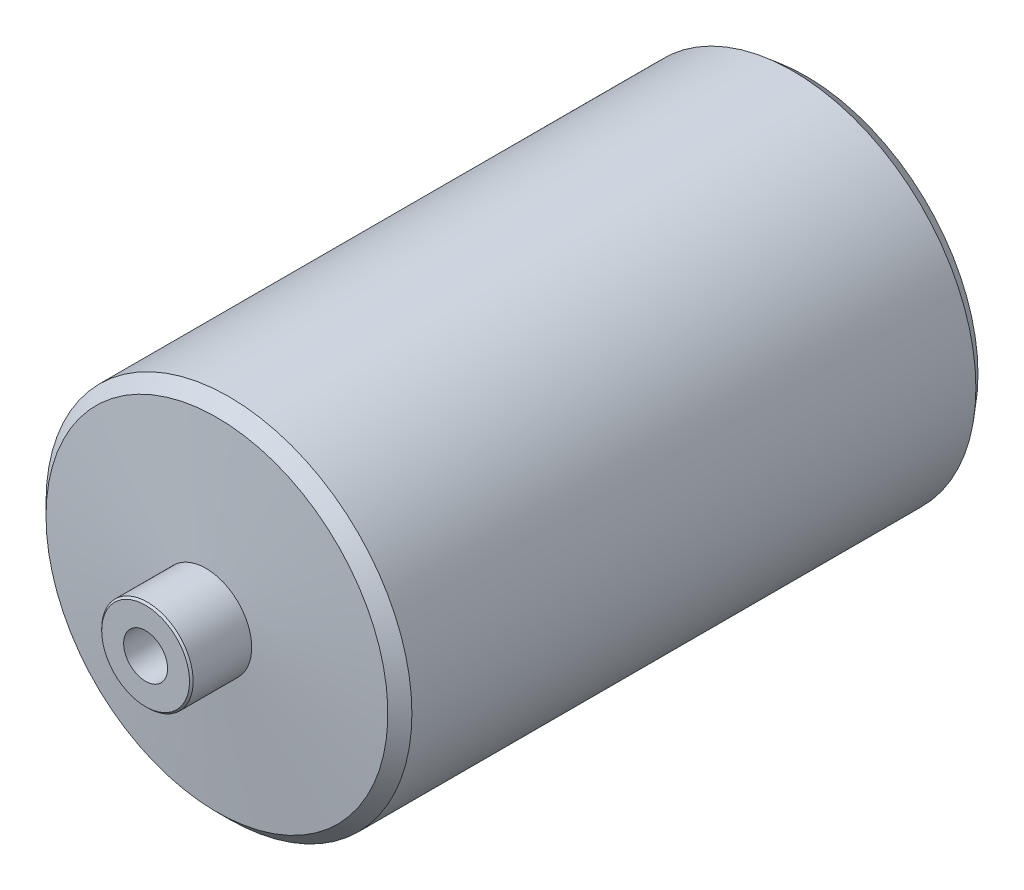
ISO-10303-21;
HEADER;
FILE_DESCRIPTION(('STEP AP214'),'2;1');
FILE_NAME('part.step','',(''),(''),'','','');
FILE_SCHEMA(('AUTOMOTIVE_DESIGN { 1 0 10303 214 1 1 1 1 }'));
ENDSEC;
DATA;
#1=APPLICATION_CONTEXT('core data for automotive mechanical design processes');
#2=APPLICATION_PROTOCOL_DEFINITION('international standard','automotive_design',2000,#1);
#3=PRODUCT_CONTEXT('',#1,'mechanical');
#4=PRODUCT('Part','Part','',(#3));
#5=PRODUCT_RELATED_PRODUCT_CATEGORY('part','',(#4));
#6=PRODUCT_DEFINITION_FORMATION('','',#4);
#7=PRODUCT_DEFINITION_CONTEXT('part definition',#1,'design');
#8=PRODUCT_DEFINITION('design','',#6,#7);
#9=PRODUCT_DEFINITION_SHAPE('','',#8);
#10=(LENGTH_UNIT() NAMED_UNIT(*) SI_UNIT(.MILLI.,.METRE.));
#11=(NAMED_UNIT(*) PLANE_ANGLE_UNIT() SI_UNIT($,.RADIAN.));
#12=(NAMED_UNIT(*) SI_UNIT($,.STERADIAN.) SOLID_ANGLE_UNIT());
#13=UNCERTAINTY_MEASURE_WITH_UNIT(LENGTH_MEASURE(1.E-05),#10,'distance_accuracy_value','');
#14=(GEOMETRIC_REPRESENTATION_CONTEXT(3) GLOBAL_UNCERTAINTY_ASSIGNED_CONTEXT((#13)) GLOBAL_UNIT_ASSIGNED_CONTEXT((#10,
#11,#12)) REPRESENTATION_CONTEXT('',''));
#15=CARTESIAN_POINT('',(0.,0.,0.));
#16=DIRECTION('',(0.,0.,1.));
#17=DIRECTION('',(1.,0.,0.));
#18=AXIS2_PLACEMENT_3D('',#15,#16,#17);
#19=CARTESIAN_POINT('',(0.,0.,0.));
#20=DIRECTION('',(0.,0.,1.));
#21=DIRECTION('',(1.,0.,0.));
#22=AXIS2_PLACEMENT_3D('',#19,#20,#21);
#23=PLANE('',#22);
#24=CARTESIAN_POINT('',(0.,0.,0.));
#25=DIRECTION('',(0.,0.,1.));
#26=DIRECTION('',(1.,0.,0.));
#27=AXIS2_PLACEMENT_3D('',#24,#25,#26);
#28=CIRCLE('',#27,12.);
#29=CARTESIAN_POINT('',(12.,0.,0.));
#30=VERTEX_POINT('',#29);
#31=EDGE_CURVE('E112',#30,#30,#28,.F.);
#32=ORIENTED_EDGE('',*,*,#31,.T.);
#33=EDGE_LOOP('',(#32));
#34=FACE_BOUND('',#33,.T.);
#35=CARTESIAN_POINT('',(0.,0.,0.));
#36=DIRECTION('',(0.,0.,-1.));
#37=DIRECTION('',(-1.,0.,0.));
#38=AXIS2_PLACEMENT_3D('',#35,#36,#37);
#39=CIRCLE('',#38,6.);
#40=CARTESIAN_POINT('',(-6.,0.,0.));
#41=VERTEX_POINT('',#40);
#42=EDGE_CURVE('E70',#41,#41,#39,.T.);
#43=ORIENTED_EDGE('',*,*,#42,.F.);
#44=EDGE_LOOP('',(#43));
#45=FACE_BOUND('',#44,.T.);
#46=ADVANCED_FACE('F43',(#34,#45),#23,.F.);
#47=CARTESIAN_POINT('',(0.,0.,200.));
#48=DIRECTION('',(0.,0.,1.));
#49=DIRECTION('',(1.,0.,0.));
#50=AXIS2_PLACEMENT_3D('',#47,#48,#49);
#51=CYLINDRICAL_SURFACE('',#50,12.5);
#52=CARTESIAN_POINT('',(0.,0.,0.500000000000056));
#53=DIRECTION('',(0.,0.,1.));
#54=DIRECTION('',(1.,0.,0.));
#55=AXIS2_PLACEMENT_3D('',#52,#53,#54);
#56=CIRCLE('',#55,12.5);
#57=CARTESIAN_POINT('',(12.5,0.,0.500000000000056));
#58=VERTEX_POINT('',#57);
#59=EDGE_CURVE('E108',#58,#58,#56,.T.);
#60=ORIENTED_EDGE('',*,*,#59,.T.);
#61=EDGE_LOOP('',(#60));
#62=FACE_BOUND('',#61,.T.);
#63=CARTESIAN_POINT('',(0.,0.,16.5));
#64=DIRECTION('',(0.,0.,1.));
#65=DIRECTION('',(1.,0.,0.));
#66=AXIS2_PLACEMENT_3D('',#63,#64,#65);
#67=CIRCLE('',#66,12.5);
#68=CARTESIAN_POINT('',(12.5,0.,16.5));
#69=VERTEX_POINT('',#68);
#70=EDGE_CURVE('E88',#69,#69,#67,.T.);
#71=ORIENTED_EDGE('',*,*,#70,.F.);
#72=EDGE_LOOP('',(#71));
#73=FACE_BOUND('',#72,.T.);
#74=ADVANCED_FACE('F131',(#62,#73),#51,.T.);
#75=CARTESIAN_POINT('',(0.,0.,16.5));
#76=DIRECTION('',(0.,0.,1.));
#77=DIRECTION('',(1.,0.,0.));
#78=AXIS2_PLACEMENT_3D('',#75,#76,#77);
#79=CONICAL_SURFACE('',#78,12.5,1.48352986419518);
#80=CARTESIAN_POINT('',(0.,0.,19.5193576539793));
#81=DIRECTION('',(0.,0.,-1.));
#82=DIRECTION('',(-1.,0.,0.));
#83=AXIS2_PLACEMENT_3D('',#80,#81,#82);
#84=CIRCLE('',#83,47.0114159057248);
#85=CARTESIAN_POINT('',(47.0114159057248,0.,19.5193576539793));
#86=VERTEX_POINT('',#85);
#87=EDGE_CURVE('E104',#86,#86,#84,.T.);
#88=CARTESIAN_POINT('',(47.0114159057248,0.,19.5193576539793));
#89=CARTESIAN_POINT('',(46.6519219900401,0.,19.4879060117503));
#90=CARTESIAN_POINT('',(46.2924280743555,0.,19.4564543695214));
#91=CARTESIAN_POINT('',(45.5734402429862,0.,19.3935510850635));
#92=CARTESIAN_POINT('',(45.2139463273016,0.,19.3620994428345));
#93=CARTESIAN_POINT('',(44.4949584959323,0.,19.2991961583766));
#94=CARTESIAN_POINT('',(44.1354645802477,0.,19.2677445161477));
#95=CARTESIAN_POINT('',(43.4164767488784,0.,19.2048412316898));
#96=CARTESIAN_POINT('',(43.0569828331938,0.,19.1733895894608));
#97=CARTESIAN_POINT('',(42.3379950018245,0.,19.1104863050029));
#98=CARTESIAN_POINT('',(41.9785010861399,0.,19.079034662774));
#99=CARTESIAN_POINT('',(41.2595132547706,0.,19.0161313783161));
#100=CARTESIAN_POINT('',(40.900019339086,0.,18.9846797360871));
#101=CARTESIAN_POINT('',(40.1810315077167,0.,18.9217764516292));
#102=CARTESIAN_POINT('',(39.8215375920321,0.,18.8903248094003));
#103=CARTESIAN_POINT('',(39.1025497606628,0.,18.8274215249424));
#104=CARTESIAN_POINT('',(38.7430558449782,0.,18.7959698827134));
#105=CARTESIAN_POINT('',(38.0240680136089,0.,18.7330665982555));
#106=CARTESIAN_POINT('',(37.6645740979243,0.,18.7016149560266));
#107=CARTESIAN_POINT('',(36.945586266555,0.,18.6387116715687));
#108=CARTESIAN_POINT('',(36.5860923508704,0.,18.6072600293397));
#109=CARTESIAN_POINT('',(35.8671045195011,0.,18.5443567448818));
#110=CARTESIAN_POINT('',(35.5076106038165,0.,18.5129051026529));
#111=CARTESIAN_POINT('',(34.7886227724472,0.,18.450001818195));
#112=CARTESIAN_POINT('',(34.4291288567626,0.,18.418550175966));
#113=CARTESIAN_POINT('',(33.7101410253933,0.,18.3556468915081));
#114=CARTESIAN_POINT('',(33.3506471097087,0.,18.3241952492792));
#115=CARTESIAN_POINT('',(32.6316592783394,0.,18.2612919648213));
#116=CARTESIAN_POINT('',(32.2721653626548,0.,18.2298403225923));
#117=CARTESIAN_POINT('',(31.5531775312855,0.,18.1669370381344));
#118=CARTESIAN_POINT('',(31.1936836156009,0.,18.1354853959055));
#119=CARTESIAN_POINT('',(30.4746957842316,0.,18.0725821114476));
#120=CARTESIAN_POINT('',(30.115201868547,0.,18.0411304692186));
#121=CARTESIAN_POINT('',(29.3962140371777,0.,17.9782271847607));
#122=CARTESIAN_POINT('',(29.0367201214931,0.,17.9467755425317));
#123=CARTESIAN_POINT('',(28.3177322901238,0.,17.8838722580739));
#124=CARTESIAN_POINT('',(27.9582383744392,0.,17.8524206158449));
#125=CARTESIAN_POINT('',(27.2392505430699,0.,17.789517331387));
#126=CARTESIAN_POINT('',(26.8797566273853,0.,17.758065689158));
#127=CARTESIAN_POINT('',(26.160768796016,0.,17.6951624047001));
#128=CARTESIAN_POINT('',(25.8012748803314,0.,17.6637107624712));
#129=CARTESIAN_POINT('',(25.0822870489621,0.,17.6008074780133));
#130=CARTESIAN_POINT('',(24.7227931332775,0.,17.5693558357843));
#131=CARTESIAN_POINT('',(24.0038053019082,0.,17.5064525513264));
#132=CARTESIAN_POINT('',(23.6443113862236,0.,17.4750009090975));
#133=CARTESIAN_POINT('',(22.9253235548543,0.,17.4120976246396));
#134=CARTESIAN_POINT('',(22.5658296391697,0.,17.3806459824106));
#135=CARTESIAN_POINT('',(21.8468418078004,0.,17.3177426979527));
#136=CARTESIAN_POINT('',(21.4873478921158,0.,17.2862910557238));
#137=CARTESIAN_POINT('',(20.7683600607465,0.,17.2233877712659));
#138=CARTESIAN_POINT('',(20.4088661450619,0.,17.1919361290369));
#139=CARTESIAN_POINT('',(19.6898783136926,0.,17.129032844579));
#140=CARTESIAN_POINT('',(19.330384398008,0.,17.0975812023501));
#141=CARTESIAN_POINT('',(18.6113965666387,0.,17.0346779178922));
#142=CARTESIAN_POINT('',(18.2519026509541,0.,17.0032262756632));
#143=CARTESIAN_POINT('',(17.5329148195848,0.,16.9403229912053));
#144=CARTESIAN_POINT('',(17.1734209039002,0.,16.9088713489764));
#145=CARTESIAN_POINT('',(16.4544330725309,0.,16.8459680645185));
#146=CARTESIAN_POINT('',(16.0949391568463,0.,16.8145164222895));
#147=CARTESIAN_POINT('',(15.375951325477,0.,16.7516131378316));
#148=CARTESIAN_POINT('',(15.0164574097924,0.,16.7201614956027));
#149=CARTESIAN_POINT('',(14.2974695784231,0.,16.6572582111448));
#150=CARTESIAN_POINT('',(13.9379756627385,0.,16.6258065689158));
#151=CARTESIAN_POINT('',(13.2189878313692,0.,16.5629032844579));
#152=CARTESIAN_POINT('',(12.8594939156846,0.,16.531451642229));
#153=CARTESIAN_POINT('',(12.5,0.,16.5));
#154=B_SPLINE_CURVE_WITH_KNOTS('',3,(#88,#89,#90,#91,#92,#93,#94,#95,#96,#97,#98,#99,#100,#101,
#102,#103,#104,#105,#106,#107,#108,#109,#110,#111,#112,#113,#114,#115,#116,#117,#118,#119,#120,
#121,#122,#123,#124,#125,#126,#127,#128,#129,#130,#131,#132,#133,#134,#135,#136,#137,#138,#139,
#140,#141,#142,#143,#144,#145,#146,#147,#148,#149,#150,#151,#152,#153),.UNSPECIFIED.,.F.,.F.,(4,
2,2,2,2,2,2,2,2,2,2,2,2,2,2,2,2,2,2,2,2,2,2,2,2,2,2,2,2,2,2,2,4),(0.,1.08260137212111,
2.16520274424222,3.24780411636333,4.33040548848444,5.41300686060555,6.49560823272667,
7.57820960484777,8.66081097696888,9.74341234909,10.8260137212111,11.9086150933322,
12.9912164654533,14.0738178375744,15.1564192096956,16.2390205818167,17.3216219539378,
18.4042233260589,19.48682469818,20.5694260703011,21.6520274424222,22.7346288145433,
23.8172301866644,24.8998315587855,25.9824329309067,27.0650343030278,28.1476356751489,
29.23023704727,30.3128384193911,31.3954397915122,32.4780411636333,33.5606425357544,
34.6432439078756),.UNSPECIFIED.);
#155=EDGE_CURVE('BSEAM137',#86,#69,#154,.T.);
#156=ORIENTED_EDGE('',*,*,#87,.T.);
#157=ORIENTED_EDGE('',*,*,#70,.T.);
#158=ORIENTED_EDGE('',*,*,#155,.T.);
#159=ORIENTED_EDGE('',*,*,#155,.F.);
#160=EDGE_LOOP('',(#156,#158,#157,#159));
#161=FACE_BOUND('',#160,.T.);
#162=ADVANCED_FACE('F137',(#161),#79,.T.);
#163=CARTESIAN_POINT('',(0.,0.,200.));
#164=DIRECTION('',(0.,0.,1.));
#165=DIRECTION('',(1.,0.,0.));
#166=AXIS2_PLACEMENT_3D('',#163,#164,#165);
#167=CYLINDRICAL_SURFACE('',#166,50.);
#168=CARTESIAN_POINT('',(0.,0.,177.219175117778));
#169=DIRECTION('',(0.,0.,-1.));
#170=DIRECTION('',(-1.,0.,0.));
#171=AXIS2_PLACEMENT_3D('',#168,#169,#170);
#172=CIRCLE('',#171,50.);
#173=CARTESIAN_POINT('',(-50.,0.,177.219175117778));
#174=VERTEX_POINT('',#173);
#175=EDGE_CURVE('E100',#174,#174,#172,.T.);
#176=ORIENTED_EDGE('',*,*,#175,.T.);
#177=EDGE_LOOP('',(#176));
#178=FACE_BOUND('',#177,.T.);
#179=CARTESIAN_POINT('',(0.,0.,23.0810134851017));
#180=DIRECTION('',(0.,0.,1.));
#181=DIRECTION('',(1.,0.,0.));
#182=AXIS2_PLACEMENT_3D('',#179,#180,#181);
#183=CIRCLE('',#182,50.);
#184=CARTESIAN_POINT('',(50.,0.,23.0810134851017));
#185=VERTEX_POINT('',#184);
#186=EDGE_CURVE('E96',#185,#185,#183,.T.);
#187=ORIENTED_EDGE('',*,*,#186,.T.);
#188=EDGE_LOOP('',(#187));
#189=FACE_BOUND('',#188,.T.);
#190=ADVANCED_FACE('F170',(#178,#189),#167,.T.);
#191=CARTESIAN_POINT('',(0.,0.,180.219175117778));
#192=DIRECTION('',(0.,0.,-1.));
#193=DIRECTION('',(-1.,0.,0.));
#194=AXIS2_PLACEMENT_3D('',#191,#192,#193);
#195=CONICAL_SURFACE('',#194,50.,1.48352986419518);
#196=CARTESIAN_POINT('',(0.,0.,180.506805506669));
#197=DIRECTION('',(0.,0.,1.));
#198=DIRECTION('',(1.,0.,0.));
#199=AXIS2_PLACEMENT_3D('',#196,#197,#198);
#200=CIRCLE('',#199,46.7123696111086);
#201=CARTESIAN_POINT('',(-46.7123696111086,0.,180.506805506669));
#202=VERTEX_POINT('',#201);
#203=EDGE_CURVE('E92',#202,#202,#200,.T.);
#204=CARTESIAN_POINT('',(0.,0.,183.5));
#205=DIRECTION('',(0.,0.,1.));
#206=DIRECTION('',(1.,0.,0.));
#207=AXIS2_PLACEMENT_3D('',#204,#205,#206);
#208=CIRCLE('',#207,12.5);
#209=CARTESIAN_POINT('',(-12.5000000000002,0.,183.5));
#210=VERTEX_POINT('',#209);
#211=EDGE_CURVE('E84',#210,#210,#208,.T.);
#212=CARTESIAN_POINT('',(-46.7123696111086,0.,180.506805506669));
#213=CARTESIAN_POINT('',(-46.3559907609929,0.,180.537984615975));
#214=CARTESIAN_POINT('',(-45.9996119108771,0.,180.56916372528));
#215=CARTESIAN_POINT('',(-45.2868542106457,0.,180.631521943891));
#216=CARTESIAN_POINT('',(-44.93047536053,0.,180.662701053197));
#217=CARTESIAN_POINT('',(-44.2177176602986,0.,180.725059271808));
#218=CARTESIAN_POINT('',(-43.8613388101829,0.,180.756238381113));
#219=CARTESIAN_POINT('',(-43.1485811099515,0.,180.818596599724));
#220=CARTESIAN_POINT('',(-42.7922022598357,0.,180.84977570903));
#221=CARTESIAN_POINT('',(-42.0794445596043,0.,180.912133927641));
#222=CARTESIAN_POINT('',(-41.7230657094886,0.,180.943313036947));
#223=CARTESIAN_POINT('',(-41.0103080092572,0.,181.005671255558));
#224=CARTESIAN_POINT('',(-40.6539291591415,0.,181.036850364863));
#225=CARTESIAN_POINT('',(-39.94117145891,0.,181.099208583474));
#226=CARTESIAN_POINT('',(-39.5847926087943,0.,181.13038769278));
#227=CARTESIAN_POINT('',(-38.8720349085629,0.,181.192745911391));
#228=CARTESIAN_POINT('',(-38.5156560584472,0.,181.223925020696));
#229=CARTESIAN_POINT('',(-37.8028983582158,0.,181.286283239307));
#230=CARTESIAN_POINT('',(-37.4465195081,0.,181.317462348613));
#231=CARTESIAN_POINT('',(-36.7337618078686,0.,181.379820567224));
#232=CARTESIAN_POINT('',(-36.3773829577529,0.,181.410999676529));
#233=CARTESIAN_POINT('',(-35.6646252575215,0.,181.473357895141));
#234=CARTESIAN_POINT('',(-35.3082464074058,0.,181.504537004446));
#235=CARTESIAN_POINT('',(-34.5954887071743,0.,181.566895223057));
#236=CARTESIAN_POINT('',(-34.2391098570586,0.,181.598074332363));
#237=CARTESIAN_POINT('',(-33.5263521568272,0.,181.660432550974));
#238=CARTESIAN_POINT('',(-33.1699733067115,0.,181.691611660279));
#239=CARTESIAN_POINT('',(-32.4572156064801,0.,181.75396987889));
#240=CARTESIAN_POINT('',(-32.1008367563644,0.,181.785148988196));
#241=CARTESIAN_POINT('',(-31.3880790561329,0.,181.847507206807));
#242=CARTESIAN_POINT('',(-31.0317002060172,0.,181.878686316112));
#243=CARTESIAN_POINT('',(-30.3189425057858,0.,181.941044534723));
#244=CARTESIAN_POINT('',(-29.9625636556701,0.,181.972223644029));
#245=CARTESIAN_POINT('',(-29.2498059554387,0.,182.03458186264));
#246=CARTESIAN_POINT('',(-28.8934271053229,0.,182.065760971946));
#247=CARTESIAN_POINT('',(-28.1806694050915,0.,182.128119190557));
#248=CARTESIAN_POINT('',(-27.8242905549758,0.,182.159298299862));
#249=CARTESIAN_POINT('',(-27.1115328547444,0.,182.221656518473));
#250=CARTESIAN_POINT('',(-26.7551540046287,0.,182.252835627779));
#251=CARTESIAN_POINT('',(-26.0423963043972,0.,182.31519384639));
#252=CARTESIAN_POINT('',(-25.6860174542815,0.,182.346372955695));
#253=CARTESIAN_POINT('',(-24.9732597540501,0.,182.408731174306));
#254=CARTESIAN_POINT('',(-24.6168809039344,0.,182.439910283612));
#255=CARTESIAN_POINT('',(-23.904123203703,0.,182.502268502223));
#256=CARTESIAN_POINT('',(-23.5477443535873,0.,182.533447611529));
#257=CARTESIAN_POINT('',(-22.8349866533558,0.,182.59580583014));
#258=CARTESIAN_POINT('',(-22.4786078032401,0.,182.626984939445));
#259=CARTESIAN_POINT('',(-21.7658501030087,0.,182.689343158056));
#260=CARTESIAN_POINT('',(-21.409471252893,0.,182.720522267362));
#261=CARTESIAN_POINT('',(-20.6967135526616,0.,182.782880485973));
#262=CARTESIAN_POINT('',(-20.3403347025458,0.,182.814059595278));
#263=CARTESIAN_POINT('',(-19.6275770023144,0.,182.876417813889));
#264=CARTESIAN_POINT('',(-19.2711981521987,0.,182.907596923195));
#265=CARTESIAN_POINT('',(-18.5584404519673,0.,182.969955141806));
#266=CARTESIAN_POINT('',(-18.2020616018516,0.,183.001134251111));
#267=CARTESIAN_POINT('',(-17.4893039016201,0.,183.063492469723));
#268=CARTESIAN_POINT('',(-17.1329250515044,0.,183.094671579028));
#269=CARTESIAN_POINT('',(-16.420167351273,0.,183.157029797639));
#270=CARTESIAN_POINT('',(-16.0637885011573,0.,183.188208906945));
#271=CARTESIAN_POINT('',(-15.3510308009259,0.,183.250567125556));
#272=CARTESIAN_POINT('',(-14.9946519508102,0.,183.281746234861));
#273=CARTESIAN_POINT('',(-14.2818942505787,0.,183.344104453472));
#274=CARTESIAN_POINT('',(-13.925515400463,0.,183.375283562778));
#275=CARTESIAN_POINT('',(-13.2127577002316,0.,183.437641781389));
#276=CARTESIAN_POINT('',(-12.8563788501159,0.,183.468820890694));
#277=CARTESIAN_POINT('',(-12.5000000000002,0.,183.5));
#278=B_SPLINE_CURVE_WITH_KNOTS('',3,(#212,#213,#214,#215,#216,#217,#218,#219,#220,#221,#222,
#223,#224,#225,#226,#227,#228,#229,#230,#231,#232,#233,#234,#235,#236,#237,#238,#239,#240,#241,
#242,#243,#244,#245,#246,#247,#248,#249,#250,#251,#252,#253,#254,#255,#256,#257,#258,#259,#260,
#261,#262,#263,#264,#265,#266,#267,#268,#269,#270,#271,#272,#273,#274,#275,#276,#277),
.UNSPECIFIED.,.F.,.F.,(4,2,2,2,2,2,2,2,2,2,2,2,2,2,2,2,2,2,2,2,2,2,2,2,2,2,2,2,2,2,2,2,4),(0.,
1.07322047828112,2.14644095656224,3.21966143484335,4.29288191312447,5.36610239140559,
6.43932286968671,7.51254334796783,8.58576382624895,9.65898430453007,10.7322047828112,
11.8054252610923,12.8786457393734,13.9518662176545,15.0250866959357,16.0983071742168,
17.1715276524979,18.244748130779,19.3179686090601,20.3911890873413,21.4644095656224,
22.5376300439035,23.6108505221846,24.6840710004657,25.7572914787469,26.830511957028,
27.9037324353091,28.9769529135902,30.0501733918713,31.1233938701525,32.1966143484336,
33.2698348267147,34.3430553049958),.UNSPECIFIED.);
#279=EDGE_CURVE('BSEAM172',#202,#210,#278,.T.);
#280=ORIENTED_EDGE('',*,*,#203,.T.);
#281=ORIENTED_EDGE('',*,*,#211,.F.);
#282=ORIENTED_EDGE('',*,*,#279,.T.);
#283=ORIENTED_EDGE('',*,*,#279,.F.);
#284=EDGE_LOOP('',(#280,#282,#281,#283));
#285=FACE_BOUND('',#284,.T.);
#286=ADVANCED_FACE('F172',(#285),#195,.T.);
#287=CARTESIAN_POINT('',(0.,0.,200.));
#288=DIRECTION('',(0.,0.,1.));
#289=DIRECTION('',(1.,0.,0.));
#290=AXIS2_PLACEMENT_3D('',#287,#288,#289);
#291=CYLINDRICAL_SURFACE('',#290,12.5);
#292=CARTESIAN_POINT('',(0.,0.,199.5));
#293=DIRECTION('',(0.,0.,-1.));
#294=DIRECTION('',(-1.,0.,0.));
#295=AXIS2_PLACEMENT_3D('',#292,#293,#294);
#296=CIRCLE('',#295,12.5);
#297=CARTESIAN_POINT('',(-12.5,0.,199.5));
#298=VERTEX_POINT('',#297);
#299=EDGE_CURVE('E11',#298,#298,#296,.T.);
#300=ORIENTED_EDGE('',*,*,#299,.T.);
#301=EDGE_LOOP('',(#300));
#302=FACE_BOUND('',#301,.T.);
#303=ORIENTED_EDGE('',*,*,#211,.T.);
#304=EDGE_LOOP('',(#303));
#305=FACE_BOUND('',#304,.T.);
#306=ADVANCED_FACE('F179',(#302,#305),#291,.T.);
#307=CARTESIAN_POINT('',(0.,12.5,200.));
#308=DIRECTION('',(0.,0.,-1.));
#309=DIRECTION('',(-1.,0.,0.));
#310=AXIS2_PLACEMENT_3D('',#307,#308,#309);
#311=PLANE('',#310);
#312=CARTESIAN_POINT('',(0.,0.,200.));
#313=DIRECTION('',(0.,0.,-1.));
#314=DIRECTION('',(-1.,0.,0.));
#315=AXIS2_PLACEMENT_3D('',#312,#313,#314);
#316=CIRCLE('',#315,12.);
#317=CARTESIAN_POINT('',(-12.,0.,200.));
#318=VERTEX_POINT('',#317);
#319=EDGE_CURVE('E53',#318,#318,#316,.F.);
#320=ORIENTED_EDGE('',*,*,#319,.T.);
#321=EDGE_LOOP('',(#320));
#322=FACE_BOUND('',#321,.T.);
#323=CARTESIAN_POINT('',(0.,0.,200.));
#324=DIRECTION('',(0.,0.,1.));
#325=DIRECTION('',(1.,0.,0.));
#326=AXIS2_PLACEMENT_3D('',#323,#324,#325);
#327=CIRCLE('',#326,5.99999999999999);
#328=CARTESIAN_POINT('',(5.99999999999999,0.,200.));
#329=VERTEX_POINT('',#328);
#330=EDGE_CURVE('E71',#329,#329,#327,.T.);
#331=ORIENTED_EDGE('',*,*,#330,.F.);
#332=EDGE_LOOP('',(#331));
#333=FACE_BOUND('',#332,.T.);
#334=ADVANCED_FACE('F119',(#322,#333),#311,.F.);
#335=CARTESIAN_POINT('',(0.,0.,180.506805506669));
#336=DIRECTION('',(0.,0.,-1.));
#337=DIRECTION('',(-1.,0.,0.));
#338=AXIS2_PLACEMENT_3D('',#335,#336,#337);
#339=CONICAL_SURFACE('',#338,46.7123696111086,0.785398163397452);
#340=CARTESIAN_POINT('',(-50.,0.,177.219175117778));
#341=CARTESIAN_POINT('',(-49.9657538501157,0.,177.253421267662));
#342=CARTESIAN_POINT('',(-49.9315077002314,0.,177.287667417546));
#343=CARTESIAN_POINT('',(-49.8630154004628,0.,177.356159717315));
#344=CARTESIAN_POINT('',(-49.8287692505786,0.,177.390405867199));
#345=CARTESIAN_POINT('',(-49.76027695081,0.,177.458898166968));
#346=CARTESIAN_POINT('',(-49.7260308009257,0.,177.493144316852));
#347=CARTESIAN_POINT('',(-49.6575385011571,0.,177.561636616621));
#348=CARTESIAN_POINT('',(-49.6232923512728,0.,177.595882766505));
#349=CARTESIAN_POINT('',(-49.5548000515043,0.,177.664375066273));
#350=CARTESIAN_POINT('',(-49.52055390162,0.,177.698621216158));
#351=CARTESIAN_POINT('',(-49.4520616018514,0.,177.767113515926));
#352=CARTESIAN_POINT('',(-49.4178154519671,0.,177.801359665811));
#353=CARTESIAN_POINT('',(-49.3493231521986,0.,177.869851965579));
#354=CARTESIAN_POINT('',(-49.3150770023143,0.,177.904098115463));
#355=CARTESIAN_POINT('',(-49.2465847025457,0.,177.972590415232));
#356=CARTESIAN_POINT('',(-49.2123385526614,0.,178.006836565116));
#357=CARTESIAN_POINT('',(-49.1438462528928,0.,178.075328864885));
#358=CARTESIAN_POINT('',(-49.1096001030086,0.,178.109575014769));
#359=CARTESIAN_POINT('',(-49.04110780324,0.,178.178067314538));
#360=CARTESIAN_POINT('',(-49.0068616533557,0.,178.212313464422));
#361=CARTESIAN_POINT('',(-48.9383693535871,0.,178.280805764191));
#362=CARTESIAN_POINT('',(-48.9041232037029,0.,178.315051914075));
#363=CARTESIAN_POINT('',(-48.8356309039343,0.,178.383544213843));
#364=CARTESIAN_POINT('',(-48.80138475405,0.,178.417790363728));
#365=CARTESIAN_POINT('',(-48.7328924542814,0.,178.486282663496));
#366=CARTESIAN_POINT('',(-48.6986463043971,0.,178.520528813381));
#367=CARTESIAN_POINT('',(-48.6301540046286,0.,178.589021113149));
#368=CARTESIAN_POINT('',(-48.5959078547443,0.,178.623267263033));
#369=CARTESIAN_POINT('',(-48.5274155549757,0.,178.691759562802));
#370=CARTESIAN_POINT('',(-48.4931694050914,0.,178.726005712686));
#371=CARTESIAN_POINT('',(-48.4246771053229,0.,178.794498012455));
#372=CARTESIAN_POINT('',(-48.3904309554386,0.,178.828744162339));
#373=CARTESIAN_POINT('',(-48.32193865567,0.,178.897236462108));
#374=CARTESIAN_POINT('',(-48.2876925057857,0.,178.931482611992));
#375=CARTESIAN_POINT('',(-48.2192002060171,0.,178.999974911761));
#376=CARTESIAN_POINT('',(-48.1849540561329,0.,179.034221061645));
#377=CARTESIAN_POINT('',(-48.1164617563643,0.,179.102713361413));
#378=CARTESIAN_POINT('',(-48.08221560648,0.,179.136959511298));
#379=CARTESIAN_POINT('',(-48.0137233067114,0.,179.205451811066));
#380=CARTESIAN_POINT('',(-47.9794771568272,0.,179.239697960951));
#381=CARTESIAN_POINT('',(-47.9109848570586,0.,179.308190260719));
#382=CARTESIAN_POINT('',(-47.8767387071743,0.,179.342436410603));
#383=CARTESIAN_POINT('',(-47.8082464074057,0.,179.410928710372));
#384=CARTESIAN_POINT('',(-47.7740002575214,0.,179.445174860256));
#385=CARTESIAN_POINT('',(-47.7055079577529,0.,179.513667160025));
#386=CARTESIAN_POINT('',(-47.6712618078686,0.,179.547913309909));
#387=CARTESIAN_POINT('',(-47.6027695081,0.,179.616405609678));
#388=CARTESIAN_POINT('',(-47.5685233582157,0.,179.650651759562));
#389=CARTESIAN_POINT('',(-47.5000310584472,0.,179.719144059331));
#390=CARTESIAN_POINT('',(-47.4657849085629,0.,179.753390209215));
#391=CARTESIAN_POINT('',(-47.3972926087943,0.,179.821882508983));
#392=CARTESIAN_POINT('',(-47.36304645891,0.,179.856128658868));
#393=CARTESIAN_POINT('',(-47.2945541591414,0.,179.924620958636));
#394=CARTESIAN_POINT('',(-47.2603080092572,0.,179.958867108521));
#395=CARTESIAN_POINT('',(-47.1918157094886,0.,180.027359408289));
#396=CARTESIAN_POINT('',(-47.1575695596043,0.,180.061605558173));
#397=CARTESIAN_POINT('',(-47.0890772598357,0.,180.130097857942));
#398=CARTESIAN_POINT('',(-47.0548311099514,0.,180.164344007826));
#399=CARTESIAN_POINT('',(-46.9863388101829,0.,180.232836307595));
#400=CARTESIAN_POINT('',(-46.9520926602986,0.,180.267082457479));
#401=CARTESIAN_POINT('',(-46.88360036053,0.,180.335574757248));
#402=CARTESIAN_POINT('',(-46.8493542106457,0.,180.369820907132));
#403=CARTESIAN_POINT('',(-46.7808619108772,0.,180.438313206901));
#404=CARTESIAN_POINT('',(-46.7466157609929,0.,180.472559356785));
#405=CARTESIAN_POINT('',(-46.7123696111086,0.,180.506805506669));
#406=B_SPLINE_CURVE_WITH_KNOTS('',3,(#340,#341,#342,#343,#344,#345,#346,#347,#348,#349,#350,
#351,#352,#353,#354,#355,#356,#357,#358,#359,#360,#361,#362,#363,#364,#365,#366,#367,#368,#369,
#370,#371,#372,#373,#374,#375,#376,#377,#378,#379,#380,#381,#382,#383,#384,#385,#386,#387,#388,
#389,#390,#391,#392,#393,#394,#395,#396,#397,#398,#399,#400,#401,#402,#403,#404,#405),
.UNSPECIFIED.,.F.,.F.,(4,2,2,2,2,2,2,2,2,2,2,2,2,2,2,2,2,2,2,2,2,2,2,2,2,2,2,2,2,2,2,2,4),(0.,
0.145294108876257,0.290588217752515,0.435882326628772,0.58117643550501,0.726470544381272,
0.87176465325753,1.01705876213379,1.16235287101002,1.30764697988628,1.45294108876254,
1.5982351976388,1.74352930651504,1.8888234153913,2.03411752426755,2.17941163314381,
2.32470574202005,2.46999985089631,2.61529395977256,2.76058806864882,2.90588217752506,
3.05117628640132,3.19647039527758,3.34176450415384,3.48705861303009,3.63235272190633,
3.77764683078259,3.92294093965885,4.06823504853511,4.21352915741134,4.3588232662876,
4.50411737516386,4.6494114840401),.UNSPECIFIED.);
#407=EDGE_CURVE('BSEAM144',#174,#202,#406,.T.);
#408=ORIENTED_EDGE('',*,*,#175,.F.);
#409=ORIENTED_EDGE('',*,*,#203,.F.);
#410=ORIENTED_EDGE('',*,*,#407,.T.);
#411=ORIENTED_EDGE('',*,*,#407,.F.);
#412=EDGE_LOOP('',(#408,#410,#409,#411));
#413=FACE_BOUND('',#412,.T.);
#414=ADVANCED_FACE('F144',(#413),#339,.T.);
#415=CARTESIAN_POINT('',(0.,0.,23.0810134851017));
#416=DIRECTION('',(0.,0.,1.));
#417=DIRECTION('',(1.,0.,0.));
#418=AXIS2_PLACEMENT_3D('',#415,#416,#417);
#419=CONICAL_SURFACE('',#418,50.,0.698131700797729);
#420=ORIENTED_EDGE('',*,*,#87,.F.);
#421=EDGE_LOOP('',(#420));
#422=FACE_BOUND('',#421,.T.);
#423=ORIENTED_EDGE('',*,*,#186,.F.);
#424=EDGE_LOOP('',(#423));
#425=FACE_BOUND('',#424,.T.);
#426=ADVANCED_FACE('F150',(#422,#425),#419,.T.);
#427=CARTESIAN_POINT('',(0.,0.,55.3948362858347));
#428=DIRECTION('',(0.,0.,-1.));
#429=DIRECTION('',(-1.,0.,0.));
#430=AXIS2_PLACEMENT_3D('',#427,#428,#429);
#431=CONICAL_SURFACE('',#430,5.99999999999999,1.02974425867665);
#432=CARTESIAN_POINT('',(0.,0.,59.));
#433=VERTEX_POINT('',#432);
#434=VERTEX_LOOP('',#433);
#435=FACE_BOUND('',#434,.T.);
#436=CARTESIAN_POINT('',(0.,0.,55.3948362858347));
#437=DIRECTION('',(0.,0.,-1.));
#438=DIRECTION('',(-1.,0.,0.));
#439=AXIS2_PLACEMENT_3D('',#436,#437,#438);
#440=CIRCLE('',#439,5.99999999999999);
#441=CARTESIAN_POINT('',(-5.99999999999999,0.,55.3948362858347));
#442=VERTEX_POINT('',#441);
#443=EDGE_CURVE('E76',#442,#442,#440,.T.);
#444=ORIENTED_EDGE('',*,*,#443,.T.);
#445=EDGE_LOOP('',(#444));
#446=FACE_BOUND('',#445,.T.);
#447=ADVANCED_FACE('F156',(#435,#446),#431,.F.);
#448=CARTESIAN_POINT('',(0.,0.,0.));
#449=DIRECTION('',(0.,0.,-1.));
#450=DIRECTION('',(-1.,0.,0.));
#451=AXIS2_PLACEMENT_3D('',#448,#449,#450);
#452=CYLINDRICAL_SURFACE('',#451,6.);
#453=ORIENTED_EDGE('',*,*,#443,.F.);
#454=EDGE_LOOP('',(#453));
#455=FACE_BOUND('',#454,.T.);
#456=ORIENTED_EDGE('',*,*,#42,.T.);
#457=EDGE_LOOP('',(#456));
#458=FACE_BOUND('',#457,.T.);
#459=ADVANCED_FACE('F63',(#455,#458),#452,.F.);
#460=CARTESIAN_POINT('',(0.,0.,144.605163714165));
#461=DIRECTION('',(0.,0.,1.));
#462=DIRECTION('',(1.,0.,0.));
#463=AXIS2_PLACEMENT_3D('',#460,#461,#462);
#464=CONICAL_SURFACE('',#463,5.99999999999999,1.02974425867665);
#465=CARTESIAN_POINT('',(0.,0.,141.));
#466=VERTEX_POINT('',#465);
#467=VERTEX_LOOP('',#466);
#468=FACE_BOUND('',#467,.T.);
#469=CARTESIAN_POINT('',(0.,0.,144.605163714165));
#470=DIRECTION('',(0.,0.,1.));
#471=DIRECTION('',(1.,0.,0.));
#472=AXIS2_PLACEMENT_3D('',#469,#470,#471);
#473=CIRCLE('',#472,5.99999999999999);
#474=CARTESIAN_POINT('',(5.99999999999999,0.,144.605163714165));
#475=VERTEX_POINT('',#474);
#476=EDGE_CURVE('E67',#475,#475,#473,.T.);
#477=ORIENTED_EDGE('',*,*,#476,.T.);
#478=EDGE_LOOP('',(#477));
#479=FACE_BOUND('',#478,.T.);
#480=ADVANCED_FACE('F59',(#468,#479),#464,.F.);
#481=CARTESIAN_POINT('',(0.,0.,200.));
#482=DIRECTION('',(0.,0.,1.));
#483=DIRECTION('',(1.,0.,0.));
#484=AXIS2_PLACEMENT_3D('',#481,#482,#483);
#485=CYLINDRICAL_SURFACE('',#484,5.99999999999999);
#486=ORIENTED_EDGE('',*,*,#476,.F.);
#487=EDGE_LOOP('',(#486));
#488=FACE_BOUND('',#487,.T.);
#489=ORIENTED_EDGE('',*,*,#330,.T.);
#490=EDGE_LOOP('',(#489));
#491=FACE_BOUND('',#490,.T.);
#492=ADVANCED_FACE('F62',(#488,#491),#485,.F.);
#493=CARTESIAN_POINT('',(0.,0.,0.500000000000056));
#494=DIRECTION('',(0.,0.,1.));
#495=DIRECTION('',(1.,0.,0.));
#496=AXIS2_PLACEMENT_3D('',#493,#494,#495);
#497=CONICAL_SURFACE('',#496,12.5,0.785398163397438);
#498=ORIENTED_EDGE('',*,*,#31,.F.);
#499=EDGE_LOOP('',(#498));
#500=FACE_BOUND('',#499,.T.);
#501=ORIENTED_EDGE('',*,*,#59,.F.);
#502=EDGE_LOOP('',(#501));
#503=FACE_BOUND('',#502,.T.);
#504=ADVANCED_FACE('F123',(#500,#503),#497,.T.);
#505=CARTESIAN_POINT('',(0.,0.,200.));
#506=DIRECTION('',(0.,0.,-1.));
#507=DIRECTION('',(-1.,0.,0.));
#508=AXIS2_PLACEMENT_3D('',#505,#506,#507);
#509=CONICAL_SURFACE('',#508,12.,0.78539816339744);
#510=ORIENTED_EDGE('',*,*,#299,.F.);
#511=EDGE_LOOP('',(#510));
#512=FACE_BOUND('',#511,.T.);
#513=ORIENTED_EDGE('',*,*,#319,.F.);
#514=EDGE_LOOP('',(#513));
#515=FACE_BOUND('',#514,.T.);
#516=ADVANCED_FACE('F46',(#512,#515),#509,.T.);
#517=CLOSED_SHELL('',(#46,#74,#162,#190,#286,#306,#334,#414,#426,#447,#459,#480,#492,#504,#516));
#518=MANIFOLD_SOLID_BREP('B2',#517);
#519=ADVANCED_BREP_SHAPE_REPRESENTATION('',(#18,#518),#14);
#520=SHAPE_DEFINITION_REPRESENTATION(#9,#519);
ENDSEC;
END-ISO-10303-21;
